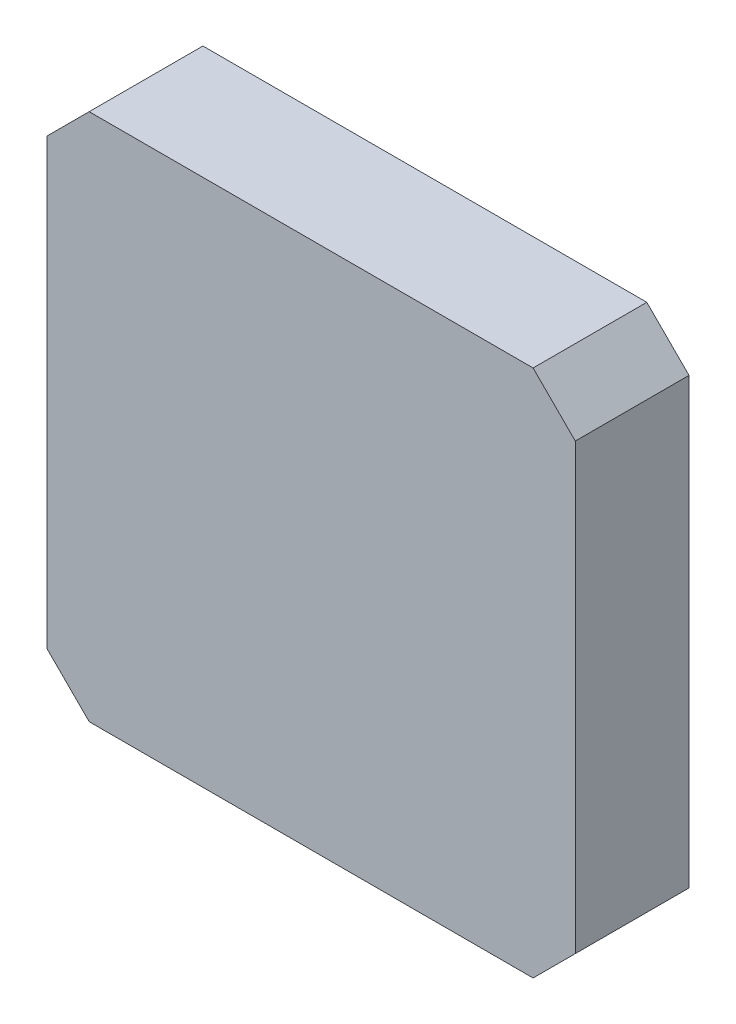
ISO-10303-21;
HEADER;
FILE_DESCRIPTION(('STEP AP214'),'2;1');
FILE_NAME('part.step','',(''),(''),'','','');
FILE_SCHEMA(('AUTOMOTIVE_DESIGN { 1 0 10303 214 1 1 1 1 }'));
ENDSEC;
DATA;
#1=APPLICATION_CONTEXT('core data for automotive mechanical design processes');
#2=APPLICATION_PROTOCOL_DEFINITION('international standard','automotive_design',2000,#1);
#3=PRODUCT_CONTEXT('',#1,'mechanical');
#4=PRODUCT('Part','Part','',(#3));
#5=PRODUCT_RELATED_PRODUCT_CATEGORY('part','',(#4));
#6=PRODUCT_DEFINITION_FORMATION('','',#4);
#7=PRODUCT_DEFINITION_CONTEXT('part definition',#1,'design');
#8=PRODUCT_DEFINITION('design','',#6,#7);
#9=PRODUCT_DEFINITION_SHAPE('','',#8);
#10=(LENGTH_UNIT() NAMED_UNIT(*) SI_UNIT(.MILLI.,.METRE.));
#11=(NAMED_UNIT(*) PLANE_ANGLE_UNIT() SI_UNIT($,.RADIAN.));
#12=(NAMED_UNIT(*) SI_UNIT($,.STERADIAN.) SOLID_ANGLE_UNIT());
#13=UNCERTAINTY_MEASURE_WITH_UNIT(LENGTH_MEASURE(1.E-05),#10,'distance_accuracy_value','');
#14=(GEOMETRIC_REPRESENTATION_CONTEXT(3) GLOBAL_UNCERTAINTY_ASSIGNED_CONTEXT((#13)) GLOBAL_UNIT_ASSIGNED_CONTEXT((#10,
#11,#12)) REPRESENTATION_CONTEXT('',''));
#15=CARTESIAN_POINT('',(0.,0.,0.));
#16=DIRECTION('',(0.,0.,1.));
#17=DIRECTION('',(1.,0.,0.));
#18=AXIS2_PLACEMENT_3D('',#15,#16,#17);
#19=CARTESIAN_POINT('',(6.625,0.,0.));
#20=DIRECTION('',(-0.707106781186548,0.707106781186548,0.));
#21=DIRECTION('',(0.,0.,1.));
#22=AXIS2_PLACEMENT_3D('',#19,#20,#21);
#23=PLANE('',#22);
#24=DIRECTION('',(0.,0.,1.));
#25=VECTOR('',#24,1.);
#26=CARTESIAN_POINT('',(7.2,0.575,0.));
#27=LINE('',#26,#25);
#28=CARTESIAN_POINT('',(7.2,0.575,0.));
#29=VERTEX_POINT('',#28);
#30=CARTESIAN_POINT('',(7.2,0.575,1.55));
#31=VERTEX_POINT('',#30);
#32=EDGE_CURVE('E11',#29,#31,#27,.T.);
#33=ORIENTED_EDGE('',*,*,#32,.T.);
#34=DIRECTION('',(-0.707106781186548,-0.707106781186548,0.));
#35=VECTOR('',#34,1.);
#36=CARTESIAN_POINT('',(4.96875,-1.65625,1.55));
#37=LINE('',#36,#35);
#38=CARTESIAN_POINT('',(6.625,0.,1.55));
#39=VERTEX_POINT('',#38);
#40=EDGE_CURVE('E159',#31,#39,#37,.T.);
#41=ORIENTED_EDGE('',*,*,#40,.T.);
#42=DIRECTION('',(0.,0.,1.));
#43=VECTOR('',#42,1.);
#44=CARTESIAN_POINT('',(6.625,0.,0.));
#45=LINE('',#44,#43);
#46=CARTESIAN_POINT('',(6.625,0.,0.));
#47=VERTEX_POINT('',#46);
#48=EDGE_CURVE('E42',#47,#39,#45,.T.);
#49=ORIENTED_EDGE('',*,*,#48,.F.);
#50=DIRECTION('',(0.707106781186548,0.707106781186548,0.));
#51=VECTOR('',#50,1.);
#52=CARTESIAN_POINT('',(6.625,0.,0.));
#53=LINE('',#52,#51);
#54=EDGE_CURVE('E90',#47,#29,#53,.T.);
#55=ORIENTED_EDGE('',*,*,#54,.T.);
#56=EDGE_LOOP('',(#33,#41,#49,#55));
#57=FACE_BOUND('',#56,.T.);
#58=ADVANCED_FACE('F17',(#57),#23,.F.);
#59=CARTESIAN_POINT('',(7.2,0.,0.));
#60=DIRECTION('',(1.,0.,0.));
#61=DIRECTION('',(0.,1.,0.));
#62=AXIS2_PLACEMENT_3D('',#59,#60,#61);
#63=PLANE('',#62);
#64=DIRECTION('',(0.,1.,0.));
#65=VECTOR('',#64,1.);
#66=CARTESIAN_POINT('',(7.2,0.,1.55));
#67=LINE('',#66,#65);
#68=CARTESIAN_POINT('',(7.2,6.625,1.55));
#69=VERTEX_POINT('',#68);
#70=EDGE_CURVE('E152',#31,#69,#67,.T.);
#71=ORIENTED_EDGE('',*,*,#70,.F.);
#72=ORIENTED_EDGE('',*,*,#32,.F.);
#73=DIRECTION('',(0.,1.,0.));
#74=VECTOR('',#73,1.);
#75=CARTESIAN_POINT('',(7.2,0.,0.));
#76=LINE('',#75,#74);
#77=CARTESIAN_POINT('',(7.2,6.625,0.));
#78=VERTEX_POINT('',#77);
#79=EDGE_CURVE('E132',#29,#78,#76,.T.);
#80=ORIENTED_EDGE('',*,*,#79,.T.);
#81=DIRECTION('',(0.,0.,1.));
#82=VECTOR('',#81,1.);
#83=CARTESIAN_POINT('',(7.2,6.625,0.));
#84=LINE('',#83,#82);
#85=EDGE_CURVE('E28',#78,#69,#84,.T.);
#86=ORIENTED_EDGE('',*,*,#85,.T.);
#87=EDGE_LOOP('',(#71,#72,#80,#86));
#88=FACE_BOUND('',#87,.T.);
#89=ADVANCED_FACE('F148',(#88),#63,.T.);
#90=CARTESIAN_POINT('',(7.2,6.625,0.));
#91=DIRECTION('',(-0.707106781186548,-0.707106781186548,0.));
#92=DIRECTION('',(-0.707106781186548,0.707106781186548,0.));
#93=AXIS2_PLACEMENT_3D('',#90,#91,#92);
#94=PLANE('',#93);
#95=DIRECTION('',(0.,0.,1.));
#96=VECTOR('',#95,1.);
#97=CARTESIAN_POINT('',(6.625,7.2,0.));
#98=LINE('',#97,#96);
#99=CARTESIAN_POINT('',(6.625,7.2,0.));
#100=VERTEX_POINT('',#99);
#101=CARTESIAN_POINT('',(6.625,7.2,1.55));
#102=VERTEX_POINT('',#101);
#103=EDGE_CURVE('E21',#100,#102,#98,.T.);
#104=ORIENTED_EDGE('',*,*,#103,.T.);
#105=DIRECTION('',(0.707106781186548,-0.707106781186548,0.));
#106=VECTOR('',#105,1.);
#107=CARTESIAN_POINT('',(7.05625,6.76875,1.55));
#108=LINE('',#107,#106);
#109=EDGE_CURVE('E125',#102,#69,#108,.T.);
#110=ORIENTED_EDGE('',*,*,#109,.T.);
#111=ORIENTED_EDGE('',*,*,#85,.F.);
#112=DIRECTION('',(-0.707106781186548,0.707106781186548,0.));
#113=VECTOR('',#112,1.);
#114=CARTESIAN_POINT('',(7.2,6.625,0.));
#115=LINE('',#114,#113);
#116=EDGE_CURVE('E130',#78,#100,#115,.T.);
#117=ORIENTED_EDGE('',*,*,#116,.T.);
#118=EDGE_LOOP('',(#104,#110,#111,#117));
#119=FACE_BOUND('',#118,.T.);
#120=ADVANCED_FACE('F178',(#119),#94,.F.);
#121=CARTESIAN_POINT('',(0.,7.2,0.));
#122=DIRECTION('',(0.,1.,0.));
#123=DIRECTION('',(1.,0.,0.));
#124=AXIS2_PLACEMENT_3D('',#121,#122,#123);
#125=PLANE('',#124);
#126=DIRECTION('',(1.,0.,0.));
#127=VECTOR('',#126,1.);
#128=CARTESIAN_POINT('',(0.,7.2,0.));
#129=LINE('',#128,#127);
#130=CARTESIAN_POINT('',(0.575,7.2,0.));
#131=VERTEX_POINT('',#130);
#132=EDGE_CURVE('E126',#131,#100,#129,.T.);
#133=ORIENTED_EDGE('',*,*,#132,.F.);
#134=DIRECTION('',(0.,0.,1.));
#135=VECTOR('',#134,1.);
#136=CARTESIAN_POINT('',(0.575,7.2,0.));
#137=LINE('',#136,#135);
#138=CARTESIAN_POINT('',(0.575,7.2,1.55));
#139=VERTEX_POINT('',#138);
#140=EDGE_CURVE('E170',#131,#139,#137,.T.);
#141=ORIENTED_EDGE('',*,*,#140,.T.);
#142=DIRECTION('',(1.,0.,0.));
#143=VECTOR('',#142,1.);
#144=CARTESIAN_POINT('',(0.,7.2,1.55));
#145=LINE('',#144,#143);
#146=EDGE_CURVE('E121',#139,#102,#145,.T.);
#147=ORIENTED_EDGE('',*,*,#146,.T.);
#148=ORIENTED_EDGE('',*,*,#103,.F.);
#149=EDGE_LOOP('',(#133,#141,#147,#148));
#150=FACE_BOUND('',#149,.T.);
#151=ADVANCED_FACE('F213',(#150),#125,.T.);
#152=CARTESIAN_POINT('',(0.,0.,0.));
#153=DIRECTION('',(0.,1.,0.));
#154=DIRECTION('',(1.,0.,0.));
#155=AXIS2_PLACEMENT_3D('',#152,#153,#154);
#156=PLANE('',#155);
#157=ORIENTED_EDGE('',*,*,#48,.T.);
#158=DIRECTION('',(1.,0.,0.));
#159=VECTOR('',#158,1.);
#160=CARTESIAN_POINT('',(0.,0.,1.55));
#161=LINE('',#160,#159);
#162=CARTESIAN_POINT('',(0.575,0.,1.55));
#163=VERTEX_POINT('',#162);
#164=EDGE_CURVE('E104',#163,#39,#161,.T.);
#165=ORIENTED_EDGE('',*,*,#164,.F.);
#166=DIRECTION('',(0.,0.,1.));
#167=VECTOR('',#166,1.);
#168=CARTESIAN_POINT('',(0.575,0.,0.));
#169=LINE('',#168,#167);
#170=CARTESIAN_POINT('',(0.575,0.,0.));
#171=VERTEX_POINT('',#170);
#172=EDGE_CURVE('E99',#171,#163,#169,.T.);
#173=ORIENTED_EDGE('',*,*,#172,.F.);
#174=DIRECTION('',(1.,0.,0.));
#175=VECTOR('',#174,1.);
#176=CARTESIAN_POINT('',(0.,0.,0.));
#177=LINE('',#176,#175);
#178=EDGE_CURVE('E82',#171,#47,#177,.T.);
#179=ORIENTED_EDGE('',*,*,#178,.T.);
#180=EDGE_LOOP('',(#157,#165,#173,#179));
#181=FACE_BOUND('',#180,.T.);
#182=ADVANCED_FACE('F107',(#181),#156,.F.);
#183=CARTESIAN_POINT('',(0.,0.,0.));
#184=DIRECTION('',(0.,0.,1.));
#185=DIRECTION('',(1.,0.,0.));
#186=AXIS2_PLACEMENT_3D('',#183,#184,#185);
#187=PLANE('',#186);
#188=DIRECTION('',(-0.707106781186548,-0.707106781186548,0.));
#189=VECTOR('',#188,1.);
#190=CARTESIAN_POINT('',(0.575,7.2,0.));
#191=LINE('',#190,#189);
#192=CARTESIAN_POINT('',(0.,6.625,0.));
#193=VERTEX_POINT('',#192);
#194=EDGE_CURVE('E131',#131,#193,#191,.T.);
#195=ORIENTED_EDGE('',*,*,#194,.F.);
#196=ORIENTED_EDGE('',*,*,#132,.T.);
#197=ORIENTED_EDGE('',*,*,#116,.F.);
#198=ORIENTED_EDGE('',*,*,#79,.F.);
#199=ORIENTED_EDGE('',*,*,#54,.F.);
#200=ORIENTED_EDGE('',*,*,#178,.F.);
#201=DIRECTION('',(0.707106781186548,-0.707106781186548,0.));
#202=VECTOR('',#201,1.);
#203=CARTESIAN_POINT('',(0.,0.575,0.));
#204=LINE('',#203,#202);
#205=CARTESIAN_POINT('',(0.,0.575,0.));
#206=VERTEX_POINT('',#205);
#207=EDGE_CURVE('E87',#206,#171,#204,.T.);
#208=ORIENTED_EDGE('',*,*,#207,.F.);
#209=DIRECTION('',(0.,1.,0.));
#210=VECTOR('',#209,1.);
#211=CARTESIAN_POINT('',(0.,0.,0.));
#212=LINE('',#211,#210);
#213=EDGE_CURVE('E117',#206,#193,#212,.T.);
#214=ORIENTED_EDGE('',*,*,#213,.T.);
#215=EDGE_LOOP('',(#195,#196,#197,#198,#199,#200,#208,#214));
#216=FACE_BOUND('',#215,.T.);
#217=ADVANCED_FACE('F85',(#216),#187,.F.);
#218=CARTESIAN_POINT('',(0.575,7.2,0.));
#219=DIRECTION('',(0.707106781186548,-0.707106781186548,0.));
#220=DIRECTION('',(0.,0.,-1.));
#221=AXIS2_PLACEMENT_3D('',#218,#219,#220);
#222=PLANE('',#221);
#223=DIRECTION('',(0.,0.,1.));
#224=VECTOR('',#223,1.);
#225=CARTESIAN_POINT('',(0.,6.625,0.));
#226=LINE('',#225,#224);
#227=CARTESIAN_POINT('',(0.,6.625,1.55));
#228=VERTEX_POINT('',#227);
#229=EDGE_CURVE('E136',#193,#228,#226,.T.);
#230=ORIENTED_EDGE('',*,*,#229,.T.);
#231=DIRECTION('',(0.707106781186548,0.707106781186548,0.));
#232=VECTOR('',#231,1.);
#233=CARTESIAN_POINT('',(-1.36875,5.25625,1.55));
#234=LINE('',#233,#232);
#235=EDGE_CURVE('E124',#228,#139,#234,.T.);
#236=ORIENTED_EDGE('',*,*,#235,.T.);
#237=ORIENTED_EDGE('',*,*,#140,.F.);
#238=ORIENTED_EDGE('',*,*,#194,.T.);
#239=EDGE_LOOP('',(#230,#236,#237,#238));
#240=FACE_BOUND('',#239,.T.);
#241=ADVANCED_FACE('F19',(#240),#222,.F.);
#242=CARTESIAN_POINT('',(0.,0.,1.55));
#243=DIRECTION('',(0.,0.,1.));
#244=DIRECTION('',(1.,0.,0.));
#245=AXIS2_PLACEMENT_3D('',#242,#243,#244);
#246=PLANE('',#245);
#247=DIRECTION('',(0.,1.,0.));
#248=VECTOR('',#247,1.);
#249=CARTESIAN_POINT('',(0.,0.,1.55));
#250=LINE('',#249,#248);
#251=CARTESIAN_POINT('',(0.,0.575,1.55));
#252=VERTEX_POINT('',#251);
#253=EDGE_CURVE('E139',#252,#228,#250,.T.);
#254=ORIENTED_EDGE('',*,*,#253,.F.);
#255=DIRECTION('',(-0.707106781186548,0.707106781186548,0.));
#256=VECTOR('',#255,1.);
#257=CARTESIAN_POINT('',(0.14375,0.43125,1.55));
#258=LINE('',#257,#256);
#259=EDGE_CURVE('E105',#163,#252,#258,.T.);
#260=ORIENTED_EDGE('',*,*,#259,.F.);
#261=ORIENTED_EDGE('',*,*,#164,.T.);
#262=ORIENTED_EDGE('',*,*,#40,.F.);
#263=ORIENTED_EDGE('',*,*,#70,.T.);
#264=ORIENTED_EDGE('',*,*,#109,.F.);
#265=ORIENTED_EDGE('',*,*,#146,.F.);
#266=ORIENTED_EDGE('',*,*,#235,.F.);
#267=EDGE_LOOP('',(#254,#260,#261,#262,#263,#264,#265,#266));
#268=FACE_BOUND('',#267,.T.);
#269=ADVANCED_FACE('F162',(#268),#246,.T.);
#270=CARTESIAN_POINT('',(0.,0.575,0.));
#271=DIRECTION('',(0.707106781186548,0.707106781186548,0.));
#272=DIRECTION('',(0.,0.,-1.));
#273=AXIS2_PLACEMENT_3D('',#270,#271,#272);
#274=PLANE('',#273);
#275=ORIENTED_EDGE('',*,*,#172,.T.);
#276=ORIENTED_EDGE('',*,*,#259,.T.);
#277=DIRECTION('',(0.,0.,1.));
#278=VECTOR('',#277,1.);
#279=CARTESIAN_POINT('',(0.,0.575,0.));
#280=LINE('',#279,#278);
#281=EDGE_CURVE('E101',#206,#252,#280,.T.);
#282=ORIENTED_EDGE('',*,*,#281,.F.);
#283=ORIENTED_EDGE('',*,*,#207,.T.);
#284=EDGE_LOOP('',(#275,#276,#282,#283));
#285=FACE_BOUND('',#284,.T.);
#286=ADVANCED_FACE('F97',(#285),#274,.F.);
#287=CARTESIAN_POINT('',(0.,0.,0.));
#288=DIRECTION('',(1.,0.,0.));
#289=DIRECTION('',(0.,1.,0.));
#290=AXIS2_PLACEMENT_3D('',#287,#288,#289);
#291=PLANE('',#290);
#292=ORIENTED_EDGE('',*,*,#253,.T.);
#293=ORIENTED_EDGE('',*,*,#229,.F.);
#294=ORIENTED_EDGE('',*,*,#213,.F.);
#295=ORIENTED_EDGE('',*,*,#281,.T.);
#296=EDGE_LOOP('',(#292,#293,#294,#295));
#297=FACE_BOUND('',#296,.T.);
#298=ADVANCED_FACE('F193',(#297),#291,.F.);
#299=CLOSED_SHELL('',(#58,#89,#120,#151,#182,#217,#241,#269,#286,#298));
#300=MANIFOLD_SOLID_BREP('B1',#299);
#301=ADVANCED_BREP_SHAPE_REPRESENTATION('',(#18,#300),#14);
#302=SHAPE_DEFINITION_REPRESENTATION(#9,#301);
ENDSEC;
END-ISO-10303-21;
